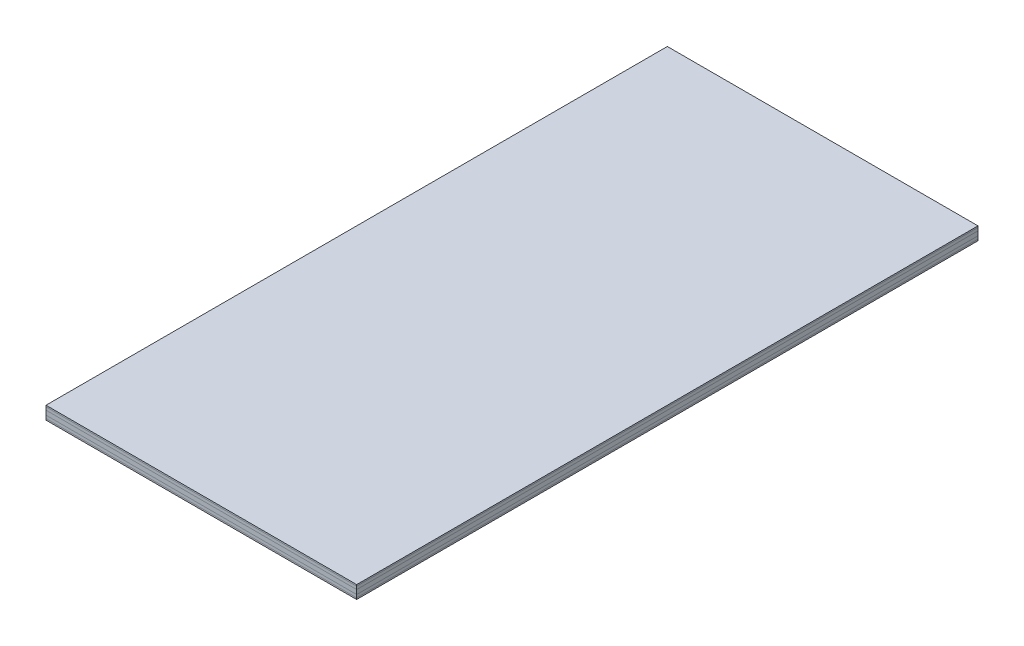
ISO-10303-21;
HEADER;
FILE_DESCRIPTION(('STEP AP214'),'2;1');
FILE_NAME('part.step','',(''),(''),'','','');
FILE_SCHEMA(('AUTOMOTIVE_DESIGN { 1 0 10303 214 1 1 1 1 }'));
ENDSEC;
DATA;
#1=APPLICATION_CONTEXT('core data for automotive mechanical design processes');
#2=APPLICATION_PROTOCOL_DEFINITION('international standard','automotive_design',2000,#1);
#3=PRODUCT_CONTEXT('',#1,'mechanical');
#4=PRODUCT('Part','Part','',(#3));
#5=PRODUCT_RELATED_PRODUCT_CATEGORY('part','',(#4));
#6=PRODUCT_DEFINITION_FORMATION('','',#4);
#7=PRODUCT_DEFINITION_CONTEXT('part definition',#1,'design');
#8=PRODUCT_DEFINITION('design','',#6,#7);
#9=PRODUCT_DEFINITION_SHAPE('','',#8);
#10=(LENGTH_UNIT() NAMED_UNIT(*) SI_UNIT(.MILLI.,.METRE.));
#11=(NAMED_UNIT(*) PLANE_ANGLE_UNIT() SI_UNIT($,.RADIAN.));
#12=(NAMED_UNIT(*) SI_UNIT($,.STERADIAN.) SOLID_ANGLE_UNIT());
#13=UNCERTAINTY_MEASURE_WITH_UNIT(LENGTH_MEASURE(1.E-05),#10,'distance_accuracy_value','');
#14=(GEOMETRIC_REPRESENTATION_CONTEXT(3) GLOBAL_UNCERTAINTY_ASSIGNED_CONTEXT((#13)) GLOBAL_UNIT_ASSIGNED_CONTEXT((#10,
#11,#12)) REPRESENTATION_CONTEXT('',''));
#15=CARTESIAN_POINT('',(0.,0.,0.));
#16=DIRECTION('',(0.,0.,1.));
#17=DIRECTION('',(1.,0.,0.));
#18=AXIS2_PLACEMENT_3D('',#15,#16,#17);
#19=CARTESIAN_POINT('',(-335.28,-2.82222222222222,-609.61));
#20=DIRECTION('',(0.,-1.,0.));
#21=DIRECTION('',(1.,0.,0.));
#22=AXIS2_PLACEMENT_3D('',#19,#20,#21);
#23=PLANE('',#22);
#24=DIRECTION('',(0.,0.,1.));
#25=VECTOR('',#24,1.);
#26=CARTESIAN_POINT('',(-304.8,-2.82222222222222,-609.6));
#27=LINE('',#26,#25);
#28=CARTESIAN_POINT('',(-304.8,-2.82222222222217,-609.6));
#29=VERTEX_POINT('',#28);
#30=CARTESIAN_POINT('',(-304.8,-2.82222222222217,609.6));
#31=VERTEX_POINT('',#30);
#32=EDGE_CURVE('E102',#29,#31,#27,.T.);
#33=ORIENTED_EDGE('',*,*,#32,.F.);
#34=DIRECTION('',(-1.,0.,0.));
#35=VECTOR('',#34,1.);
#36=CARTESIAN_POINT('',(-304.8,-2.82222222222222,-609.6));
#37=LINE('',#36,#35);
#38=CARTESIAN_POINT('',(304.8,-2.82222222222211,-609.6));
#39=VERTEX_POINT('',#38);
#40=EDGE_CURVE('E93',#39,#29,#37,.T.);
#41=ORIENTED_EDGE('',*,*,#40,.F.);
#42=DIRECTION('',(0.,0.,-1.));
#43=VECTOR('',#42,1.);
#44=CARTESIAN_POINT('',(304.8,-2.8222222222221,-609.6));
#45=LINE('',#44,#43);
#46=CARTESIAN_POINT('',(304.8,-2.82222222222217,609.6));
#47=VERTEX_POINT('',#46);
#48=EDGE_CURVE('E101',#47,#39,#45,.T.);
#49=ORIENTED_EDGE('',*,*,#48,.F.);
#50=DIRECTION('',(1.,0.,0.));
#51=VECTOR('',#50,1.);
#52=CARTESIAN_POINT('',(-304.8,-2.82222222222222,609.6));
#53=LINE('',#52,#51);
#54=EDGE_CURVE('E104',#31,#47,#53,.T.);
#55=ORIENTED_EDGE('',*,*,#54,.F.);
#56=EDGE_LOOP('',(#33,#41,#49,#55));
#57=FACE_BOUND('',#56,.T.);
#58=ADVANCED_FACE('F48',(#57),#23,.T.);
#59=CARTESIAN_POINT('',(-304.8,-25.4,-609.6));
#60=DIRECTION('',(0.,0.,-1.));
#61=DIRECTION('',(-1.,0.,0.));
#62=AXIS2_PLACEMENT_3D('',#59,#60,#61);
#63=PLANE('',#62);
#64=DIRECTION('',(0.,1.,0.));
#65=VECTOR('',#64,1.);
#66=CARTESIAN_POINT('',(304.8,-25.4,-609.6));
#67=LINE('',#66,#65);
#68=CARTESIAN_POINT('',(304.8,0.,-609.6));
#69=VERTEX_POINT('',#68);
#70=EDGE_CURVE('E98',#39,#69,#67,.T.);
#71=ORIENTED_EDGE('',*,*,#70,.F.);
#72=ORIENTED_EDGE('',*,*,#40,.T.);
#73=DIRECTION('',(0.,1.,0.));
#74=VECTOR('',#73,1.);
#75=CARTESIAN_POINT('',(-304.8,-25.4,-609.6));
#76=LINE('',#75,#74);
#77=CARTESIAN_POINT('',(-304.8,0.,-609.6));
#78=VERTEX_POINT('',#77);
#79=EDGE_CURVE('E52',#29,#78,#76,.T.);
#80=ORIENTED_EDGE('',*,*,#79,.T.);
#81=DIRECTION('',(-1.,0.,0.));
#82=VECTOR('',#81,1.);
#83=CARTESIAN_POINT('',(-304.8,0.,-609.6));
#84=LINE('',#83,#82);
#85=EDGE_CURVE('E113',#69,#78,#84,.T.);
#86=ORIENTED_EDGE('',*,*,#85,.F.);
#87=EDGE_LOOP('',(#71,#72,#80,#86));
#88=FACE_BOUND('',#87,.T.);
#89=ADVANCED_FACE('F95',(#88),#63,.T.);
#90=CARTESIAN_POINT('',(0.,0.,0.));
#91=DIRECTION('',(0.,1.,0.));
#92=DIRECTION('',(0.,0.,1.));
#93=AXIS2_PLACEMENT_3D('',#90,#91,#92);
#94=PLANE('',#93);
#95=DIRECTION('',(0.,0.,1.));
#96=VECTOR('',#95,1.);
#97=CARTESIAN_POINT('',(-304.8,0.,-609.6));
#98=LINE('',#97,#96);
#99=CARTESIAN_POINT('',(-304.8,0.,609.6));
#100=VERTEX_POINT('',#99);
#101=EDGE_CURVE('E12',#78,#100,#98,.T.);
#102=ORIENTED_EDGE('',*,*,#101,.T.);
#103=DIRECTION('',(1.,0.,0.));
#104=VECTOR('',#103,1.);
#105=CARTESIAN_POINT('',(-304.8,0.,609.6));
#106=LINE('',#105,#104);
#107=CARTESIAN_POINT('',(304.8,0.,609.6));
#108=VERTEX_POINT('',#107);
#109=EDGE_CURVE('E57',#100,#108,#106,.T.);
#110=ORIENTED_EDGE('',*,*,#109,.T.);
#111=DIRECTION('',(0.,0.,-1.));
#112=VECTOR('',#111,1.);
#113=CARTESIAN_POINT('',(304.8,0.,-609.6));
#114=LINE('',#113,#112);
#115=EDGE_CURVE('E114',#108,#69,#114,.T.);
#116=ORIENTED_EDGE('',*,*,#115,.T.);
#117=ORIENTED_EDGE('',*,*,#85,.T.);
#118=EDGE_LOOP('',(#102,#110,#116,#117));
#119=FACE_BOUND('',#118,.T.);
#120=ADVANCED_FACE('F120',(#119),#94,.T.);
#121=CARTESIAN_POINT('',(304.8,-25.4,-609.6));
#122=DIRECTION('',(1.,0.,0.));
#123=DIRECTION('',(0.,0.,-1.));
#124=AXIS2_PLACEMENT_3D('',#121,#122,#123);
#125=PLANE('',#124);
#126=DIRECTION('',(0.,1.,0.));
#127=VECTOR('',#126,1.);
#128=CARTESIAN_POINT('',(304.8,-25.4,609.6));
#129=LINE('',#128,#127);
#130=EDGE_CURVE('E72',#47,#108,#129,.T.);
#131=ORIENTED_EDGE('',*,*,#130,.F.);
#132=ORIENTED_EDGE('',*,*,#48,.T.);
#133=ORIENTED_EDGE('',*,*,#70,.T.);
#134=ORIENTED_EDGE('',*,*,#115,.F.);
#135=EDGE_LOOP('',(#131,#132,#133,#134));
#136=FACE_BOUND('',#135,.T.);
#137=ADVANCED_FACE('F125',(#136),#125,.T.);
#138=CARTESIAN_POINT('',(-304.8,-25.4,-609.6));
#139=DIRECTION('',(-1.,0.,0.));
#140=DIRECTION('',(0.,0.,1.));
#141=AXIS2_PLACEMENT_3D('',#138,#139,#140);
#142=PLANE('',#141);
#143=ORIENTED_EDGE('',*,*,#79,.F.);
#144=ORIENTED_EDGE('',*,*,#32,.T.);
#145=DIRECTION('',(0.,1.,0.));
#146=VECTOR('',#145,1.);
#147=CARTESIAN_POINT('',(-304.8,-25.4,609.6));
#148=LINE('',#147,#146);
#149=EDGE_CURVE('E65',#31,#100,#148,.T.);
#150=ORIENTED_EDGE('',*,*,#149,.T.);
#151=ORIENTED_EDGE('',*,*,#101,.F.);
#152=EDGE_LOOP('',(#143,#144,#150,#151));
#153=FACE_BOUND('',#152,.T.);
#154=ADVANCED_FACE('F106',(#153),#142,.T.);
#155=CARTESIAN_POINT('',(-304.8,-25.4,609.6));
#156=DIRECTION('',(0.,0.,1.));
#157=DIRECTION('',(1.,0.,0.));
#158=AXIS2_PLACEMENT_3D('',#155,#156,#157);
#159=PLANE('',#158);
#160=ORIENTED_EDGE('',*,*,#149,.F.);
#161=ORIENTED_EDGE('',*,*,#54,.T.);
#162=ORIENTED_EDGE('',*,*,#130,.T.);
#163=ORIENTED_EDGE('',*,*,#109,.F.);
#164=EDGE_LOOP('',(#160,#161,#162,#163));
#165=FACE_BOUND('',#164,.T.);
#166=ADVANCED_FACE('F50',(#165),#159,.T.);
#167=CLOSED_SHELL('',(#58,#89,#120,#137,#154,#166));
#168=MANIFOLD_SOLID_BREP('B2',#167);
#169=CARTESIAN_POINT('',(-335.28,-22.5777777777778,-609.61));
#170=DIRECTION('',(0.,-1.,0.));
#171=DIRECTION('',(1.,0.,0.));
#172=AXIS2_PLACEMENT_3D('',#169,#170,#171);
#173=PLANE('',#172);
#174=DIRECTION('',(0.,0.,1.));
#175=VECTOR('',#174,1.);
#176=CARTESIAN_POINT('',(-304.8,-22.5777777777778,-609.6));
#177=LINE('',#176,#175);
#178=CARTESIAN_POINT('',(-304.8,-22.5777777777777,-609.6));
#179=VERTEX_POINT('',#178);
#180=CARTESIAN_POINT('',(-304.8,-22.5777777777777,609.6));
#181=VERTEX_POINT('',#180);
#182=EDGE_CURVE('E186',#179,#181,#177,.T.);
#183=ORIENTED_EDGE('',*,*,#182,.T.);
#184=DIRECTION('',(1.,0.,0.));
#185=VECTOR('',#184,1.);
#186=CARTESIAN_POINT('',(-304.8,-22.5777777777778,609.6));
#187=LINE('',#186,#185);
#188=CARTESIAN_POINT('',(304.8,-22.5777777777777,609.6));
#189=VERTEX_POINT('',#188);
#190=EDGE_CURVE('E225',#181,#189,#187,.T.);
#191=ORIENTED_EDGE('',*,*,#190,.T.);
#192=DIRECTION('',(0.,0.,-1.));
#193=VECTOR('',#192,1.);
#194=CARTESIAN_POINT('',(304.8,-22.5777777777777,-609.6));
#195=LINE('',#194,#193);
#196=CARTESIAN_POINT('',(304.8,-22.5777777777777,-609.6));
#197=VERTEX_POINT('',#196);
#198=EDGE_CURVE('E229',#189,#197,#195,.T.);
#199=ORIENTED_EDGE('',*,*,#198,.T.);
#200=DIRECTION('',(-1.,0.,0.));
#201=VECTOR('',#200,1.);
#202=CARTESIAN_POINT('',(-304.8,-22.5777777777778,-609.6));
#203=LINE('',#202,#201);
#204=EDGE_CURVE('E232',#197,#179,#203,.T.);
#205=ORIENTED_EDGE('',*,*,#204,.T.);
#206=EDGE_LOOP('',(#183,#191,#199,#205));
#207=FACE_BOUND('',#206,.T.);
#208=ADVANCED_FACE('F182',(#207),#173,.F.);
#209=CARTESIAN_POINT('',(-304.8,-25.4,-609.6));
#210=DIRECTION('',(-1.,0.,0.));
#211=DIRECTION('',(0.,0.,1.));
#212=AXIS2_PLACEMENT_3D('',#209,#210,#211);
#213=PLANE('',#212);
#214=ORIENTED_EDGE('',*,*,#182,.F.);
#215=DIRECTION('',(0.,1.,0.));
#216=VECTOR('',#215,1.);
#217=CARTESIAN_POINT('',(-304.8,-25.4,-609.6));
#218=LINE('',#217,#216);
#219=CARTESIAN_POINT('',(-304.8,-25.4,-609.6));
#220=VERTEX_POINT('',#219);
#221=EDGE_CURVE('E235',#220,#179,#218,.T.);
#222=ORIENTED_EDGE('',*,*,#221,.F.);
#223=DIRECTION('',(0.,0.,1.));
#224=VECTOR('',#223,1.);
#225=CARTESIAN_POINT('',(-304.8,-25.4,-609.6));
#226=LINE('',#225,#224);
#227=CARTESIAN_POINT('',(-304.8,-25.4,609.6));
#228=VERTEX_POINT('',#227);
#229=EDGE_CURVE('E46',#220,#228,#226,.T.);
#230=ORIENTED_EDGE('',*,*,#229,.T.);
#231=DIRECTION('',(0.,1.,0.));
#232=VECTOR('',#231,1.);
#233=CARTESIAN_POINT('',(-304.8,-25.4,609.6));
#234=LINE('',#233,#232);
#235=EDGE_CURVE('E199',#228,#181,#234,.T.);
#236=ORIENTED_EDGE('',*,*,#235,.T.);
#237=EDGE_LOOP('',(#214,#222,#230,#236));
#238=FACE_BOUND('',#237,.T.);
#239=ADVANCED_FACE('F236',(#238),#213,.T.);
#240=CARTESIAN_POINT('',(-304.8,-25.4,-609.6));
#241=DIRECTION('',(0.,0.,-1.));
#242=DIRECTION('',(-1.,0.,0.));
#243=AXIS2_PLACEMENT_3D('',#240,#241,#242);
#244=PLANE('',#243);
#245=ORIENTED_EDGE('',*,*,#204,.F.);
#246=DIRECTION('',(0.,1.,0.));
#247=VECTOR('',#246,1.);
#248=CARTESIAN_POINT('',(304.8,-25.4,-609.6));
#249=LINE('',#248,#247);
#250=CARTESIAN_POINT('',(304.8,-25.4,-609.6));
#251=VERTEX_POINT('',#250);
#252=EDGE_CURVE('E243',#251,#197,#249,.T.);
#253=ORIENTED_EDGE('',*,*,#252,.F.);
#254=DIRECTION('',(-1.,0.,0.));
#255=VECTOR('',#254,1.);
#256=CARTESIAN_POINT('',(-304.8,-25.4,-609.6));
#257=LINE('',#256,#255);
#258=EDGE_CURVE('E238',#251,#220,#257,.T.);
#259=ORIENTED_EDGE('',*,*,#258,.T.);
#260=ORIENTED_EDGE('',*,*,#221,.T.);
#261=EDGE_LOOP('',(#245,#253,#259,#260));
#262=FACE_BOUND('',#261,.T.);
#263=ADVANCED_FACE('F253',(#262),#244,.T.);
#264=CARTESIAN_POINT('',(304.8,-25.4,-609.6));
#265=DIRECTION('',(1.,0.,0.));
#266=DIRECTION('',(0.,0.,-1.));
#267=AXIS2_PLACEMENT_3D('',#264,#265,#266);
#268=PLANE('',#267);
#269=ORIENTED_EDGE('',*,*,#198,.F.);
#270=DIRECTION('',(0.,1.,0.));
#271=VECTOR('',#270,1.);
#272=CARTESIAN_POINT('',(304.8,-25.4,609.6));
#273=LINE('',#272,#271);
#274=CARTESIAN_POINT('',(304.8,-25.4,609.6));
#275=VERTEX_POINT('',#274);
#276=EDGE_CURVE('E207',#275,#189,#273,.T.);
#277=ORIENTED_EDGE('',*,*,#276,.F.);
#278=DIRECTION('',(0.,0.,-1.));
#279=VECTOR('',#278,1.);
#280=CARTESIAN_POINT('',(304.8,-25.4,-609.6));
#281=LINE('',#280,#279);
#282=EDGE_CURVE('E241',#275,#251,#281,.T.);
#283=ORIENTED_EDGE('',*,*,#282,.T.);
#284=ORIENTED_EDGE('',*,*,#252,.T.);
#285=EDGE_LOOP('',(#269,#277,#283,#284));
#286=FACE_BOUND('',#285,.T.);
#287=ADVANCED_FACE('F250',(#286),#268,.T.);
#288=CARTESIAN_POINT('',(-304.8,-25.4,609.6));
#289=DIRECTION('',(0.,0.,1.));
#290=DIRECTION('',(1.,0.,0.));
#291=AXIS2_PLACEMENT_3D('',#288,#289,#290);
#292=PLANE('',#291);
#293=ORIENTED_EDGE('',*,*,#190,.F.);
#294=ORIENTED_EDGE('',*,*,#235,.F.);
#295=DIRECTION('',(1.,0.,0.));
#296=VECTOR('',#295,1.);
#297=CARTESIAN_POINT('',(-304.8,-25.4,609.6));
#298=LINE('',#297,#296);
#299=EDGE_CURVE('E191',#228,#275,#298,.T.);
#300=ORIENTED_EDGE('',*,*,#299,.T.);
#301=ORIENTED_EDGE('',*,*,#276,.T.);
#302=EDGE_LOOP('',(#293,#294,#300,#301));
#303=FACE_BOUND('',#302,.T.);
#304=ADVANCED_FACE('F184',(#303),#292,.T.);
#305=CARTESIAN_POINT('',(0.,-25.4,0.));
#306=DIRECTION('',(0.,1.,0.));
#307=DIRECTION('',(0.,0.,1.));
#308=AXIS2_PLACEMENT_3D('',#305,#306,#307);
#309=PLANE('',#308);
#310=ORIENTED_EDGE('',*,*,#229,.F.);
#311=ORIENTED_EDGE('',*,*,#258,.F.);
#312=ORIENTED_EDGE('',*,*,#282,.F.);
#313=ORIENTED_EDGE('',*,*,#299,.F.);
#314=EDGE_LOOP('',(#310,#311,#312,#313));
#315=FACE_BOUND('',#314,.T.);
#316=ADVANCED_FACE('F255',(#315),#309,.F.);
#317=CLOSED_SHELL('',(#208,#239,#263,#287,#304,#316));
#318=MANIFOLD_SOLID_BREP('B6',#317);
#319=CARTESIAN_POINT('',(-335.28,-16.9333333333333,-609.61));
#320=DIRECTION('',(0.,-1.,0.));
#321=DIRECTION('',(1.,0.,0.));
#322=AXIS2_PLACEMENT_3D('',#319,#320,#321);
#323=PLANE('',#322);
#324=DIRECTION('',(0.,0.,1.));
#325=VECTOR('',#324,1.);
#326=CARTESIAN_POINT('',(-304.8,-16.9333333333333,-609.6));
#327=LINE('',#326,#325);
#328=CARTESIAN_POINT('',(-304.8,-16.9333333333333,-609.6));
#329=VERTEX_POINT('',#328);
#330=CARTESIAN_POINT('',(-304.8,-16.9333333333333,609.6));
#331=VERTEX_POINT('',#330);
#332=EDGE_CURVE('E365',#329,#331,#327,.T.);
#333=ORIENTED_EDGE('',*,*,#332,.T.);
#334=DIRECTION('',(1.,0.,0.));
#335=VECTOR('',#334,1.);
#336=CARTESIAN_POINT('',(-304.8,-16.9333333333333,609.6));
#337=LINE('',#336,#335);
#338=CARTESIAN_POINT('',(304.8,-16.9333333333333,609.6));
#339=VERTEX_POINT('',#338);
#340=EDGE_CURVE('E357',#331,#339,#337,.T.);
#341=ORIENTED_EDGE('',*,*,#340,.T.);
#342=DIRECTION('',(0.,0.,-1.));
#343=VECTOR('',#342,1.);
#344=CARTESIAN_POINT('',(304.8,-16.9333333333332,-609.6));
#345=LINE('',#344,#343);
#346=CARTESIAN_POINT('',(304.8,-16.9333333333332,-609.6));
#347=VERTEX_POINT('',#346);
#348=EDGE_CURVE('E362',#339,#347,#345,.T.);
#349=ORIENTED_EDGE('',*,*,#348,.T.);
#350=DIRECTION('',(-1.,0.,0.));
#351=VECTOR('',#350,1.);
#352=CARTESIAN_POINT('',(-304.8,-16.9333333333333,-609.6));
#353=LINE('',#352,#351);
#354=EDGE_CURVE('E366',#347,#329,#353,.T.);
#355=ORIENTED_EDGE('',*,*,#354,.T.);
#356=EDGE_LOOP('',(#333,#341,#349,#355));
#357=FACE_BOUND('',#356,.T.);
#358=ADVANCED_FACE('F316',(#357),#323,.F.);
#359=CARTESIAN_POINT('',(-335.28,-22.5777777777778,-609.61));
#360=DIRECTION('',(0.,-1.,0.));
#361=DIRECTION('',(1.,0.,0.));
#362=AXIS2_PLACEMENT_3D('',#359,#360,#361);
#363=PLANE('',#362);
#364=DIRECTION('',(0.,0.,1.));
#365=VECTOR('',#364,1.);
#366=CARTESIAN_POINT('',(-304.8,-22.5777777777778,-609.6));
#367=LINE('',#366,#365);
#368=CARTESIAN_POINT('',(-304.8,-22.5777777777777,-609.6));
#369=VERTEX_POINT('',#368);
#370=CARTESIAN_POINT('',(-304.8,-22.5777777777777,609.6));
#371=VERTEX_POINT('',#370);
#372=EDGE_CURVE('E370',#369,#371,#367,.T.);
#373=ORIENTED_EDGE('',*,*,#372,.F.);
#374=DIRECTION('',(-1.,0.,0.));
#375=VECTOR('',#374,1.);
#376=CARTESIAN_POINT('',(-304.8,-22.5777777777778,-609.6));
#377=LINE('',#376,#375);
#378=CARTESIAN_POINT('',(304.8,-22.5777777777777,-609.6));
#379=VERTEX_POINT('',#378);
#380=EDGE_CURVE('E374',#379,#369,#377,.T.);
#381=ORIENTED_EDGE('',*,*,#380,.F.);
#382=DIRECTION('',(0.,0.,-1.));
#383=VECTOR('',#382,1.);
#384=CARTESIAN_POINT('',(304.8,-22.5777777777777,-609.6));
#385=LINE('',#384,#383);
#386=CARTESIAN_POINT('',(304.8,-22.5777777777777,609.6));
#387=VERTEX_POINT('',#386);
#388=EDGE_CURVE('E376',#387,#379,#385,.T.);
#389=ORIENTED_EDGE('',*,*,#388,.F.);
#390=DIRECTION('',(1.,0.,0.));
#391=VECTOR('',#390,1.);
#392=CARTESIAN_POINT('',(-304.8,-22.5777777777778,609.6));
#393=LINE('',#392,#391);
#394=EDGE_CURVE('E333',#371,#387,#393,.T.);
#395=ORIENTED_EDGE('',*,*,#394,.F.);
#396=EDGE_LOOP('',(#373,#381,#389,#395));
#397=FACE_BOUND('',#396,.T.);
#398=ADVANCED_FACE('F389',(#397),#363,.T.);
#399=CARTESIAN_POINT('',(-304.8,-25.4,-609.6));
#400=DIRECTION('',(0.,0.,-1.));
#401=DIRECTION('',(-1.,0.,0.));
#402=AXIS2_PLACEMENT_3D('',#399,#400,#401);
#403=PLANE('',#402);
#404=DIRECTION('',(0.,1.,0.));
#405=VECTOR('',#404,1.);
#406=CARTESIAN_POINT('',(304.8,-25.4,-609.6));
#407=LINE('',#406,#405);
#408=EDGE_CURVE('E383',#379,#347,#407,.T.);
#409=ORIENTED_EDGE('',*,*,#408,.F.);
#410=ORIENTED_EDGE('',*,*,#380,.T.);
#411=DIRECTION('',(0.,1.,0.));
#412=VECTOR('',#411,1.);
#413=CARTESIAN_POINT('',(-304.8,-25.4,-609.6));
#414=LINE('',#413,#412);
#415=EDGE_CURVE('E320',#369,#329,#414,.T.);
#416=ORIENTED_EDGE('',*,*,#415,.T.);
#417=ORIENTED_EDGE('',*,*,#354,.F.);
#418=EDGE_LOOP('',(#409,#410,#416,#417));
#419=FACE_BOUND('',#418,.T.);
#420=ADVANCED_FACE('F388',(#419),#403,.T.);
#421=CARTESIAN_POINT('',(304.8,-25.4,-609.6));
#422=DIRECTION('',(1.,0.,0.));
#423=DIRECTION('',(0.,0.,-1.));
#424=AXIS2_PLACEMENT_3D('',#421,#422,#423);
#425=PLANE('',#424);
#426=DIRECTION('',(0.,1.,0.));
#427=VECTOR('',#426,1.);
#428=CARTESIAN_POINT('',(304.8,-25.4,609.6));
#429=LINE('',#428,#427);
#430=EDGE_CURVE('E325',#387,#339,#429,.T.);
#431=ORIENTED_EDGE('',*,*,#430,.F.);
#432=ORIENTED_EDGE('',*,*,#388,.T.);
#433=ORIENTED_EDGE('',*,*,#408,.T.);
#434=ORIENTED_EDGE('',*,*,#348,.F.);
#435=EDGE_LOOP('',(#431,#432,#433,#434));
#436=FACE_BOUND('',#435,.T.);
#437=ADVANCED_FACE('F390',(#436),#425,.T.);
#438=CARTESIAN_POINT('',(-304.8,-25.4,-609.6));
#439=DIRECTION('',(-1.,0.,0.));
#440=DIRECTION('',(0.,0.,1.));
#441=AXIS2_PLACEMENT_3D('',#438,#439,#440);
#442=PLANE('',#441);
#443=ORIENTED_EDGE('',*,*,#415,.F.);
#444=ORIENTED_EDGE('',*,*,#372,.T.);
#445=DIRECTION('',(0.,1.,0.));
#446=VECTOR('',#445,1.);
#447=CARTESIAN_POINT('',(-304.8,-25.4,609.6));
#448=LINE('',#447,#446);
#449=EDGE_CURVE('E180',#371,#331,#448,.T.);
#450=ORIENTED_EDGE('',*,*,#449,.T.);
#451=ORIENTED_EDGE('',*,*,#332,.F.);
#452=EDGE_LOOP('',(#443,#444,#450,#451));
#453=FACE_BOUND('',#452,.T.);
#454=ADVANCED_FACE('F372',(#453),#442,.T.);
#455=CARTESIAN_POINT('',(-304.8,-25.4,609.6));
#456=DIRECTION('',(0.,0.,1.));
#457=DIRECTION('',(1.,0.,0.));
#458=AXIS2_PLACEMENT_3D('',#455,#456,#457);
#459=PLANE('',#458);
#460=ORIENTED_EDGE('',*,*,#449,.F.);
#461=ORIENTED_EDGE('',*,*,#394,.T.);
#462=ORIENTED_EDGE('',*,*,#430,.T.);
#463=ORIENTED_EDGE('',*,*,#340,.F.);
#464=EDGE_LOOP('',(#460,#461,#462,#463));
#465=FACE_BOUND('',#464,.T.);
#466=ADVANCED_FACE('F318',(#465),#459,.T.);
#467=CLOSED_SHELL('',(#358,#398,#420,#437,#454,#466));
#468=MANIFOLD_SOLID_BREP('B40',#467);
#469=CARTESIAN_POINT('',(-335.28,-8.46666666666667,-609.61));
#470=DIRECTION('',(0.,-1.,0.));
#471=DIRECTION('',(1.,0.,0.));
#472=AXIS2_PLACEMENT_3D('',#469,#470,#471);
#473=PLANE('',#472);
#474=DIRECTION('',(0.,0.,1.));
#475=VECTOR('',#474,1.);
#476=CARTESIAN_POINT('',(-304.8,-8.46666666666666,-609.6));
#477=LINE('',#476,#475);
#478=CARTESIAN_POINT('',(-304.8,-8.46666666666661,-609.6));
#479=VERTEX_POINT('',#478);
#480=CARTESIAN_POINT('',(-304.8,-8.46666666666661,609.6));
#481=VERTEX_POINT('',#480);
#482=EDGE_CURVE('E498',#479,#481,#477,.T.);
#483=ORIENTED_EDGE('',*,*,#482,.T.);
#484=DIRECTION('',(1.,0.,0.));
#485=VECTOR('',#484,1.);
#486=CARTESIAN_POINT('',(-304.8,-8.46666666666666,609.6));
#487=LINE('',#486,#485);
#488=CARTESIAN_POINT('',(304.8,-8.46666666666661,609.6));
#489=VERTEX_POINT('',#488);
#490=EDGE_CURVE('E490',#481,#489,#487,.T.);
#491=ORIENTED_EDGE('',*,*,#490,.T.);
#492=DIRECTION('',(0.,0.,-1.));
#493=VECTOR('',#492,1.);
#494=CARTESIAN_POINT('',(304.8,-8.46666666666655,-609.6));
#495=LINE('',#494,#493);
#496=CARTESIAN_POINT('',(304.8,-8.46666666666656,-609.6));
#497=VERTEX_POINT('',#496);
#498=EDGE_CURVE('E495',#489,#497,#495,.T.);
#499=ORIENTED_EDGE('',*,*,#498,.T.);
#500=DIRECTION('',(-1.,0.,0.));
#501=VECTOR('',#500,1.);
#502=CARTESIAN_POINT('',(-304.8,-8.46666666666666,-609.6));
#503=LINE('',#502,#501);
#504=EDGE_CURVE('E499',#497,#479,#503,.T.);
#505=ORIENTED_EDGE('',*,*,#504,.T.);
#506=EDGE_LOOP('',(#483,#491,#499,#505));
#507=FACE_BOUND('',#506,.T.);
#508=ADVANCED_FACE('F449',(#507),#473,.F.);
#509=CARTESIAN_POINT('',(-335.28,-16.9333333333333,-609.61));
#510=DIRECTION('',(0.,-1.,0.));
#511=DIRECTION('',(1.,0.,0.));
#512=AXIS2_PLACEMENT_3D('',#509,#510,#511);
#513=PLANE('',#512);
#514=DIRECTION('',(0.,0.,1.));
#515=VECTOR('',#514,1.);
#516=CARTESIAN_POINT('',(-304.8,-16.9333333333333,-609.6));
#517=LINE('',#516,#515);
#518=CARTESIAN_POINT('',(-304.8,-16.9333333333333,-609.6));
#519=VERTEX_POINT('',#518);
#520=CARTESIAN_POINT('',(-304.8,-16.9333333333333,609.6));
#521=VERTEX_POINT('',#520);
#522=EDGE_CURVE('E503',#519,#521,#517,.T.);
#523=ORIENTED_EDGE('',*,*,#522,.F.);
#524=DIRECTION('',(-1.,0.,0.));
#525=VECTOR('',#524,1.);
#526=CARTESIAN_POINT('',(-304.8,-16.9333333333333,-609.6));
#527=LINE('',#526,#525);
#528=CARTESIAN_POINT('',(304.8,-16.9333333333332,-609.6));
#529=VERTEX_POINT('',#528);
#530=EDGE_CURVE('E507',#529,#519,#527,.T.);
#531=ORIENTED_EDGE('',*,*,#530,.F.);
#532=DIRECTION('',(0.,0.,-1.));
#533=VECTOR('',#532,1.);
#534=CARTESIAN_POINT('',(304.8,-16.9333333333332,-609.6));
#535=LINE('',#534,#533);
#536=CARTESIAN_POINT('',(304.8,-16.9333333333333,609.6));
#537=VERTEX_POINT('',#536);
#538=EDGE_CURVE('E509',#537,#529,#535,.T.);
#539=ORIENTED_EDGE('',*,*,#538,.F.);
#540=DIRECTION('',(1.,0.,0.));
#541=VECTOR('',#540,1.);
#542=CARTESIAN_POINT('',(-304.8,-16.9333333333333,609.6));
#543=LINE('',#542,#541);
#544=EDGE_CURVE('E466',#521,#537,#543,.T.);
#545=ORIENTED_EDGE('',*,*,#544,.F.);
#546=EDGE_LOOP('',(#523,#531,#539,#545));
#547=FACE_BOUND('',#546,.T.);
#548=ADVANCED_FACE('F522',(#547),#513,.T.);
#549=CARTESIAN_POINT('',(-304.8,-25.4,-609.6));
#550=DIRECTION('',(0.,0.,-1.));
#551=DIRECTION('',(-1.,0.,0.));
#552=AXIS2_PLACEMENT_3D('',#549,#550,#551);
#553=PLANE('',#552);
#554=DIRECTION('',(0.,1.,0.));
#555=VECTOR('',#554,1.);
#556=CARTESIAN_POINT('',(304.8,-25.4,-609.6));
#557=LINE('',#556,#555);
#558=EDGE_CURVE('E516',#529,#497,#557,.T.);
#559=ORIENTED_EDGE('',*,*,#558,.F.);
#560=ORIENTED_EDGE('',*,*,#530,.T.);
#561=DIRECTION('',(0.,1.,0.));
#562=VECTOR('',#561,1.);
#563=CARTESIAN_POINT('',(-304.8,-25.4,-609.6));
#564=LINE('',#563,#562);
#565=EDGE_CURVE('E453',#519,#479,#564,.T.);
#566=ORIENTED_EDGE('',*,*,#565,.T.);
#567=ORIENTED_EDGE('',*,*,#504,.F.);
#568=EDGE_LOOP('',(#559,#560,#566,#567));
#569=FACE_BOUND('',#568,.T.);
#570=ADVANCED_FACE('F521',(#569),#553,.T.);
#571=CARTESIAN_POINT('',(304.8,-25.4,-609.6));
#572=DIRECTION('',(1.,0.,0.));
#573=DIRECTION('',(0.,0.,-1.));
#574=AXIS2_PLACEMENT_3D('',#571,#572,#573);
#575=PLANE('',#574);
#576=DIRECTION('',(0.,1.,0.));
#577=VECTOR('',#576,1.);
#578=CARTESIAN_POINT('',(304.8,-25.4,609.6));
#579=LINE('',#578,#577);
#580=EDGE_CURVE('E458',#537,#489,#579,.T.);
#581=ORIENTED_EDGE('',*,*,#580,.F.);
#582=ORIENTED_EDGE('',*,*,#538,.T.);
#583=ORIENTED_EDGE('',*,*,#558,.T.);
#584=ORIENTED_EDGE('',*,*,#498,.F.);
#585=EDGE_LOOP('',(#581,#582,#583,#584));
#586=FACE_BOUND('',#585,.T.);
#587=ADVANCED_FACE('F523',(#586),#575,.T.);
#588=CARTESIAN_POINT('',(-304.8,-25.4,-609.6));
#589=DIRECTION('',(-1.,0.,0.));
#590=DIRECTION('',(0.,0.,1.));
#591=AXIS2_PLACEMENT_3D('',#588,#589,#590);
#592=PLANE('',#591);
#593=ORIENTED_EDGE('',*,*,#565,.F.);
#594=ORIENTED_EDGE('',*,*,#522,.T.);
#595=DIRECTION('',(0.,1.,0.));
#596=VECTOR('',#595,1.);
#597=CARTESIAN_POINT('',(-304.8,-25.4,609.6));
#598=LINE('',#597,#596);
#599=EDGE_CURVE('E314',#521,#481,#598,.T.);
#600=ORIENTED_EDGE('',*,*,#599,.T.);
#601=ORIENTED_EDGE('',*,*,#482,.F.);
#602=EDGE_LOOP('',(#593,#594,#600,#601));
#603=FACE_BOUND('',#602,.T.);
#604=ADVANCED_FACE('F505',(#603),#592,.T.);
#605=CARTESIAN_POINT('',(-304.8,-25.4,609.6));
#606=DIRECTION('',(0.,0.,1.));
#607=DIRECTION('',(1.,0.,0.));
#608=AXIS2_PLACEMENT_3D('',#605,#606,#607);
#609=PLANE('',#608);
#610=ORIENTED_EDGE('',*,*,#599,.F.);
#611=ORIENTED_EDGE('',*,*,#544,.T.);
#612=ORIENTED_EDGE('',*,*,#580,.T.);
#613=ORIENTED_EDGE('',*,*,#490,.F.);
#614=EDGE_LOOP('',(#610,#611,#612,#613));
#615=FACE_BOUND('',#614,.T.);
#616=ADVANCED_FACE('F451',(#615),#609,.T.);
#617=CLOSED_SHELL('',(#508,#548,#570,#587,#604,#616));
#618=MANIFOLD_SOLID_BREP('B174',#617);
#619=CARTESIAN_POINT('',(-335.28,-2.82222222222222,-609.61));
#620=DIRECTION('',(0.,-1.,0.));
#621=DIRECTION('',(1.,0.,0.));
#622=AXIS2_PLACEMENT_3D('',#619,#620,#621);
#623=PLANE('',#622);
#624=DIRECTION('',(0.,0.,1.));
#625=VECTOR('',#624,1.);
#626=CARTESIAN_POINT('',(-304.8,-2.82222222222222,-609.6));
#627=LINE('',#626,#625);
#628=CARTESIAN_POINT('',(-304.8,-2.82222222222217,-609.6));
#629=VERTEX_POINT('',#628);
#630=CARTESIAN_POINT('',(-304.8,-2.82222222222217,609.6));
#631=VERTEX_POINT('',#630);
#632=EDGE_CURVE('E629',#629,#631,#627,.T.);
#633=ORIENTED_EDGE('',*,*,#632,.T.);
#634=DIRECTION('',(1.,0.,0.));
#635=VECTOR('',#634,1.);
#636=CARTESIAN_POINT('',(-304.8,-2.82222222222222,609.6));
#637=LINE('',#636,#635);
#638=CARTESIAN_POINT('',(304.8,-2.82222222222217,609.6));
#639=VERTEX_POINT('',#638);
#640=EDGE_CURVE('E447',#631,#639,#637,.T.);
#641=ORIENTED_EDGE('',*,*,#640,.T.);
#642=DIRECTION('',(0.,0.,-1.));
#643=VECTOR('',#642,1.);
#644=CARTESIAN_POINT('',(304.8,-2.8222222222221,-609.6));
#645=LINE('',#644,#643);
#646=CARTESIAN_POINT('',(304.8,-2.82222222222211,-609.6));
#647=VERTEX_POINT('',#646);
#648=EDGE_CURVE('E581',#639,#647,#645,.T.);
#649=ORIENTED_EDGE('',*,*,#648,.T.);
#650=DIRECTION('',(-1.,0.,0.));
#651=VECTOR('',#650,1.);
#652=CARTESIAN_POINT('',(-304.8,-2.82222222222222,-609.6));
#653=LINE('',#652,#651);
#654=EDGE_CURVE('E639',#647,#629,#653,.T.);
#655=ORIENTED_EDGE('',*,*,#654,.T.);
#656=EDGE_LOOP('',(#633,#641,#649,#655));
#657=FACE_BOUND('',#656,.T.);
#658=ADVANCED_FACE('F573',(#657),#623,.F.);
#659=CARTESIAN_POINT('',(-335.28,-8.46666666666667,-609.61));
#660=DIRECTION('',(0.,-1.,0.));
#661=DIRECTION('',(1.,0.,0.));
#662=AXIS2_PLACEMENT_3D('',#659,#660,#661);
#663=PLANE('',#662);
#664=DIRECTION('',(0.,0.,1.));
#665=VECTOR('',#664,1.);
#666=CARTESIAN_POINT('',(-304.8,-8.46666666666666,-609.6));
#667=LINE('',#666,#665);
#668=CARTESIAN_POINT('',(-304.8,-8.46666666666661,-609.6));
#669=VERTEX_POINT('',#668);
#670=CARTESIAN_POINT('',(-304.8,-8.46666666666661,609.6));
#671=VERTEX_POINT('',#670);
#672=EDGE_CURVE('E576',#669,#671,#667,.T.);
#673=ORIENTED_EDGE('',*,*,#672,.F.);
#674=DIRECTION('',(-1.,0.,0.));
#675=VECTOR('',#674,1.);
#676=CARTESIAN_POINT('',(-304.8,-8.46666666666666,-609.6));
#677=LINE('',#676,#675);
#678=CARTESIAN_POINT('',(304.8,-8.46666666666656,-609.6));
#679=VERTEX_POINT('',#678);
#680=EDGE_CURVE('E630',#679,#669,#677,.T.);
#681=ORIENTED_EDGE('',*,*,#680,.F.);
#682=DIRECTION('',(0.,0.,-1.));
#683=VECTOR('',#682,1.);
#684=CARTESIAN_POINT('',(304.8,-8.46666666666655,-609.6));
#685=LINE('',#684,#683);
#686=CARTESIAN_POINT('',(304.8,-8.46666666666661,609.6));
#687=VERTEX_POINT('',#686);
#688=EDGE_CURVE('E620',#687,#679,#685,.T.);
#689=ORIENTED_EDGE('',*,*,#688,.F.);
#690=DIRECTION('',(1.,0.,0.));
#691=VECTOR('',#690,1.);
#692=CARTESIAN_POINT('',(-304.8,-8.46666666666666,609.6));
#693=LINE('',#692,#691);
#694=EDGE_CURVE('E615',#671,#687,#693,.T.);
#695=ORIENTED_EDGE('',*,*,#694,.F.);
#696=EDGE_LOOP('',(#673,#681,#689,#695));
#697=FACE_BOUND('',#696,.T.);
#698=ADVANCED_FACE('F617',(#697),#663,.T.);
#699=CARTESIAN_POINT('',(-304.8,-25.4,-609.6));
#700=DIRECTION('',(0.,0.,-1.));
#701=DIRECTION('',(-1.,0.,0.));
#702=AXIS2_PLACEMENT_3D('',#699,#700,#701);
#703=PLANE('',#702);
#704=DIRECTION('',(0.,1.,0.));
#705=VECTOR('',#704,1.);
#706=CARTESIAN_POINT('',(304.8,-25.4,-609.6));
#707=LINE('',#706,#705);
#708=EDGE_CURVE('E634',#679,#647,#707,.T.);
#709=ORIENTED_EDGE('',*,*,#708,.F.);
#710=ORIENTED_EDGE('',*,*,#680,.T.);
#711=DIRECTION('',(0.,1.,0.));
#712=VECTOR('',#711,1.);
#713=CARTESIAN_POINT('',(-304.8,-25.4,-609.6));
#714=LINE('',#713,#712);
#715=EDGE_CURVE('E621',#669,#629,#714,.T.);
#716=ORIENTED_EDGE('',*,*,#715,.T.);
#717=ORIENTED_EDGE('',*,*,#654,.F.);
#718=EDGE_LOOP('',(#709,#710,#716,#717));
#719=FACE_BOUND('',#718,.T.);
#720=ADVANCED_FACE('F644',(#719),#703,.T.);
#721=CARTESIAN_POINT('',(304.8,-25.4,-609.6));
#722=DIRECTION('',(1.,0.,0.));
#723=DIRECTION('',(0.,0.,-1.));
#724=AXIS2_PLACEMENT_3D('',#721,#722,#723);
#725=PLANE('',#724);
#726=DIRECTION('',(0.,1.,0.));
#727=VECTOR('',#726,1.);
#728=CARTESIAN_POINT('',(304.8,-25.4,609.6));
#729=LINE('',#728,#727);
#730=EDGE_CURVE('E632',#687,#639,#729,.T.);
#731=ORIENTED_EDGE('',*,*,#730,.F.);
#732=ORIENTED_EDGE('',*,*,#688,.T.);
#733=ORIENTED_EDGE('',*,*,#708,.T.);
#734=ORIENTED_EDGE('',*,*,#648,.F.);
#735=EDGE_LOOP('',(#731,#732,#733,#734));
#736=FACE_BOUND('',#735,.T.);
#737=ADVANCED_FACE('F646',(#736),#725,.T.);
#738=CARTESIAN_POINT('',(-304.8,-25.4,-609.6));
#739=DIRECTION('',(-1.,0.,0.));
#740=DIRECTION('',(0.,0.,1.));
#741=AXIS2_PLACEMENT_3D('',#738,#739,#740);
#742=PLANE('',#741);
#743=ORIENTED_EDGE('',*,*,#715,.F.);
#744=ORIENTED_EDGE('',*,*,#672,.T.);
#745=DIRECTION('',(0.,1.,0.));
#746=VECTOR('',#745,1.);
#747=CARTESIAN_POINT('',(-304.8,-25.4,609.6));
#748=LINE('',#747,#746);
#749=EDGE_CURVE('E627',#671,#631,#748,.T.);
#750=ORIENTED_EDGE('',*,*,#749,.T.);
#751=ORIENTED_EDGE('',*,*,#632,.F.);
#752=EDGE_LOOP('',(#743,#744,#750,#751));
#753=FACE_BOUND('',#752,.T.);
#754=ADVANCED_FACE('F625',(#753),#742,.T.);
#755=CARTESIAN_POINT('',(-304.8,-25.4,609.6));
#756=DIRECTION('',(0.,0.,1.));
#757=DIRECTION('',(1.,0.,0.));
#758=AXIS2_PLACEMENT_3D('',#755,#756,#757);
#759=PLANE('',#758);
#760=ORIENTED_EDGE('',*,*,#749,.F.);
#761=ORIENTED_EDGE('',*,*,#694,.T.);
#762=ORIENTED_EDGE('',*,*,#730,.T.);
#763=ORIENTED_EDGE('',*,*,#640,.F.);
#764=EDGE_LOOP('',(#760,#761,#762,#763));
#765=FACE_BOUND('',#764,.T.);
#766=ADVANCED_FACE('F631',(#765),#759,.T.);
#767=CLOSED_SHELL('',(#658,#698,#720,#737,#754,#766));
#768=MANIFOLD_SOLID_BREP('B308',#767);
#769=ADVANCED_BREP_SHAPE_REPRESENTATION('',(#18,#168,#318,#468,#618,#768),#14);
#770=SHAPE_DEFINITION_REPRESENTATION(#9,#769);
ENDSEC;
END-ISO-10303-21;
